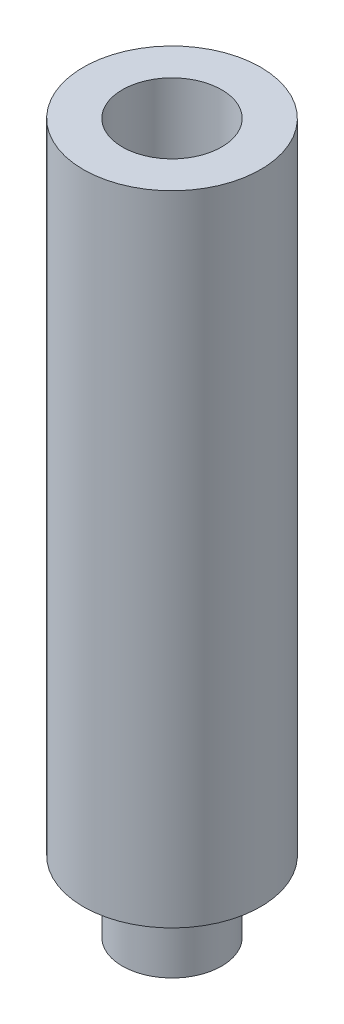
ISO-10303-21;
HEADER;
FILE_DESCRIPTION(('STEP AP214'),'2;1');
FILE_NAME('part.step','',(''),(''),'','','');
FILE_SCHEMA(('AUTOMOTIVE_DESIGN { 1 0 10303 214 1 1 1 1 }'));
ENDSEC;
DATA;
#1=APPLICATION_CONTEXT('core data for automotive mechanical design processes');
#2=APPLICATION_PROTOCOL_DEFINITION('international standard','automotive_design',2000,#1);
#3=PRODUCT_CONTEXT('',#1,'mechanical');
#4=PRODUCT('Part','Part','',(#3));
#5=PRODUCT_RELATED_PRODUCT_CATEGORY('part','',(#4));
#6=PRODUCT_DEFINITION_FORMATION('','',#4);
#7=PRODUCT_DEFINITION_CONTEXT('part definition',#1,'design');
#8=PRODUCT_DEFINITION('design','',#6,#7);
#9=PRODUCT_DEFINITION_SHAPE('','',#8);
#10=(LENGTH_UNIT() NAMED_UNIT(*) SI_UNIT(.MILLI.,.METRE.));
#11=(NAMED_UNIT(*) PLANE_ANGLE_UNIT() SI_UNIT($,.RADIAN.));
#12=(NAMED_UNIT(*) SI_UNIT($,.STERADIAN.) SOLID_ANGLE_UNIT());
#13=UNCERTAINTY_MEASURE_WITH_UNIT(LENGTH_MEASURE(1.E-05),#10,'distance_accuracy_value','');
#14=(GEOMETRIC_REPRESENTATION_CONTEXT(3) GLOBAL_UNCERTAINTY_ASSIGNED_CONTEXT((#13)) GLOBAL_UNIT_ASSIGNED_CONTEXT((#10,
#11,#12)) REPRESENTATION_CONTEXT('',''));
#15=CARTESIAN_POINT('',(0.,0.,0.));
#16=DIRECTION('',(0.,0.,1.));
#17=DIRECTION('',(1.,0.,0.));
#18=AXIS2_PLACEMENT_3D('',#15,#16,#17);
#19=CARTESIAN_POINT('',(0.,2.,0.));
#20=DIRECTION('',(0.,-1.,0.));
#21=DIRECTION('',(0.,0.,-1.));
#22=AXIS2_PLACEMENT_3D('',#19,#20,#21);
#23=CYLINDRICAL_SURFACE('',#22,1.4);
#24=CARTESIAN_POINT('',(0.,2.,0.));
#25=DIRECTION('',(0.,1.,0.));
#26=DIRECTION('',(0.,0.,1.));
#27=AXIS2_PLACEMENT_3D('',#24,#25,#26);
#28=CIRCLE('',#27,1.4);
#29=CARTESIAN_POINT('',(0.,2.,1.4));
#30=VERTEX_POINT('',#29);
#31=EDGE_CURVE('E10',#30,#30,#28,.T.);
#32=ORIENTED_EDGE('',*,*,#31,.F.);
#33=EDGE_LOOP('',(#32));
#34=FACE_BOUND('',#33,.T.);
#35=CARTESIAN_POINT('',(0.,0.,0.));
#36=DIRECTION('',(0.,1.,0.));
#37=DIRECTION('',(0.,0.,1.));
#38=AXIS2_PLACEMENT_3D('',#35,#36,#37);
#39=CIRCLE('',#38,1.4);
#40=CARTESIAN_POINT('',(0.,0.,1.4));
#41=VERTEX_POINT('',#40);
#42=EDGE_CURVE('E43',#41,#41,#39,.T.);
#43=ORIENTED_EDGE('',*,*,#42,.T.);
#44=EDGE_LOOP('',(#43));
#45=FACE_BOUND('',#44,.T.);
#46=ADVANCED_FACE('F40',(#34,#45),#23,.T.);
#47=CARTESIAN_POINT('',(0.,0.,0.));
#48=DIRECTION('',(0.,1.,0.));
#49=DIRECTION('',(0.,0.,1.));
#50=AXIS2_PLACEMENT_3D('',#47,#48,#49);
#51=PLANE('',#50);
#52=ORIENTED_EDGE('',*,*,#42,.F.);
#53=EDGE_LOOP('',(#52));
#54=FACE_BOUND('',#53,.T.);
#55=ADVANCED_FACE('F82',(#54),#51,.F.);
#56=CARTESIAN_POINT('',(0.,20.,0.));
#57=DIRECTION('',(0.,-1.,0.));
#58=DIRECTION('',(0.,0.,-1.));
#59=AXIS2_PLACEMENT_3D('',#56,#57,#58);
#60=CYLINDRICAL_SURFACE('',#59,2.5);
#61=CARTESIAN_POINT('',(0.,20.,0.));
#62=DIRECTION('',(0.,1.,0.));
#63=DIRECTION('',(0.,0.,1.));
#64=AXIS2_PLACEMENT_3D('',#61,#62,#63);
#65=CIRCLE('',#64,2.5);
#66=CARTESIAN_POINT('',(0.,20.,2.5));
#67=VERTEX_POINT('',#66);
#68=EDGE_CURVE('E50',#67,#67,#65,.T.);
#69=ORIENTED_EDGE('',*,*,#68,.F.);
#70=EDGE_LOOP('',(#69));
#71=FACE_BOUND('',#70,.T.);
#72=CARTESIAN_POINT('',(0.,2.,0.));
#73=DIRECTION('',(0.,1.,0.));
#74=DIRECTION('',(0.,0.,1.));
#75=AXIS2_PLACEMENT_3D('',#72,#73,#74);
#76=CIRCLE('',#75,2.5);
#77=CARTESIAN_POINT('',(0.,2.,2.5));
#78=VERTEX_POINT('',#77);
#79=EDGE_CURVE('E52',#78,#78,#76,.T.);
#80=ORIENTED_EDGE('',*,*,#79,.T.);
#81=EDGE_LOOP('',(#80));
#82=FACE_BOUND('',#81,.T.);
#83=ADVANCED_FACE('F76',(#71,#82),#60,.T.);
#84=CARTESIAN_POINT('',(0.,20.,0.));
#85=DIRECTION('',(0.,1.,0.));
#86=DIRECTION('',(0.,0.,1.));
#87=AXIS2_PLACEMENT_3D('',#84,#85,#86);
#88=PLANE('',#87);
#89=CARTESIAN_POINT('',(0.,20.,0.));
#90=DIRECTION('',(0.,1.,0.));
#91=DIRECTION('',(0.,0.,1.));
#92=AXIS2_PLACEMENT_3D('',#89,#90,#91);
#93=CIRCLE('',#92,1.4);
#94=CARTESIAN_POINT('',(0.,20.,1.4));
#95=VERTEX_POINT('',#94);
#96=EDGE_CURVE('E58',#95,#95,#93,.T.);
#97=ORIENTED_EDGE('',*,*,#96,.F.);
#98=EDGE_LOOP('',(#97));
#99=FACE_BOUND('',#98,.T.);
#100=ORIENTED_EDGE('',*,*,#68,.T.);
#101=EDGE_LOOP('',(#100));
#102=FACE_BOUND('',#101,.T.);
#103=ADVANCED_FACE('F73',(#99,#102),#88,.T.);
#104=CARTESIAN_POINT('',(0.,2.,0.));
#105=DIRECTION('',(0.,1.,0.));
#106=DIRECTION('',(0.,0.,1.));
#107=AXIS2_PLACEMENT_3D('',#104,#105,#106);
#108=PLANE('',#107);
#109=ORIENTED_EDGE('',*,*,#31,.T.);
#110=EDGE_LOOP('',(#109));
#111=FACE_BOUND('',#110,.T.);
#112=ORIENTED_EDGE('',*,*,#79,.F.);
#113=EDGE_LOOP('',(#112));
#114=FACE_BOUND('',#113,.T.);
#115=ADVANCED_FACE('F69',(#111,#114),#108,.F.);
#116=CARTESIAN_POINT('',(0.,17.,0.));
#117=DIRECTION('',(0.,1.,0.));
#118=DIRECTION('',(0.,0.,1.));
#119=AXIS2_PLACEMENT_3D('',#116,#117,#118);
#120=CYLINDRICAL_SURFACE('',#119,1.4);
#121=CARTESIAN_POINT('',(0.,17.,0.));
#122=DIRECTION('',(0.,1.,0.));
#123=DIRECTION('',(0.,0.,1.));
#124=AXIS2_PLACEMENT_3D('',#121,#122,#123);
#125=CIRCLE('',#124,1.4);
#126=CARTESIAN_POINT('',(0.,17.,1.4));
#127=VERTEX_POINT('',#126);
#128=EDGE_CURVE('E55',#127,#127,#125,.T.);
#129=ORIENTED_EDGE('',*,*,#128,.F.);
#130=EDGE_LOOP('',(#129));
#131=FACE_BOUND('',#130,.T.);
#132=ORIENTED_EDGE('',*,*,#96,.T.);
#133=EDGE_LOOP('',(#132));
#134=FACE_BOUND('',#133,.T.);
#135=ADVANCED_FACE('F66',(#131,#134),#120,.F.);
#136=CARTESIAN_POINT('',(0.,17.,0.));
#137=DIRECTION('',(0.,1.,0.));
#138=DIRECTION('',(0.,0.,1.));
#139=AXIS2_PLACEMENT_3D('',#136,#137,#138);
#140=PLANE('',#139);
#141=ORIENTED_EDGE('',*,*,#128,.T.);
#142=EDGE_LOOP('',(#141));
#143=FACE_BOUND('',#142,.T.);
#144=ADVANCED_FACE('F64',(#143),#140,.T.);
#145=CLOSED_SHELL('',(#46,#55,#83,#103,#115,#135,#144));
#146=MANIFOLD_SOLID_BREP('B2',#145);
#147=ADVANCED_BREP_SHAPE_REPRESENTATION('',(#18,#146),#14);
#148=SHAPE_DEFINITION_REPRESENTATION(#9,#147);
ENDSEC;
END-ISO-10303-21;
